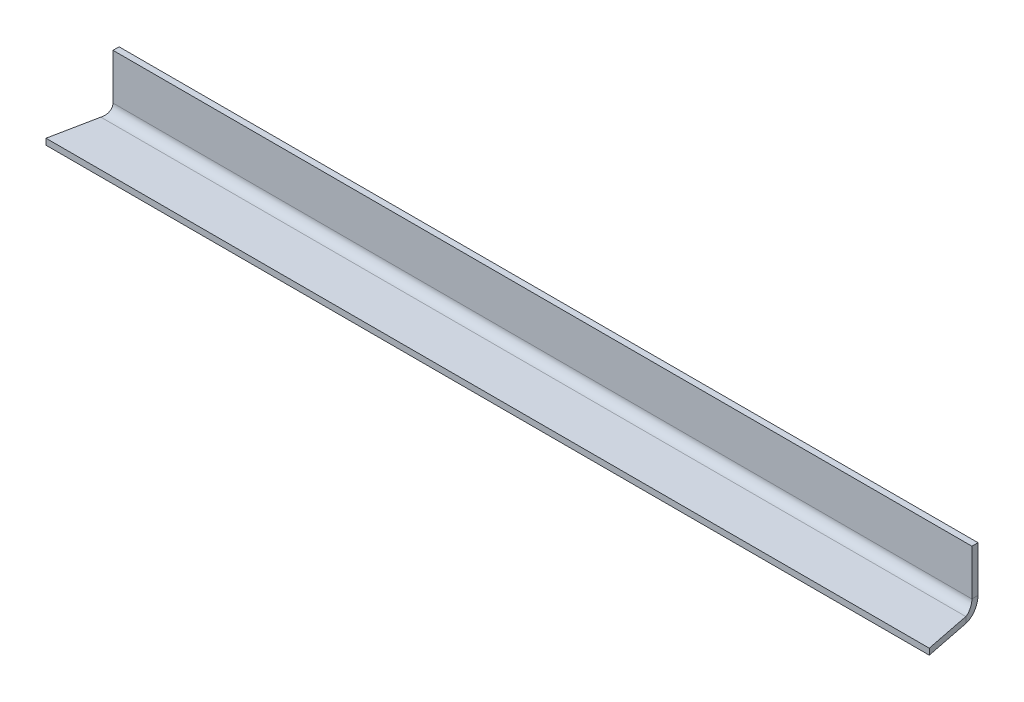
ISO-10303-21;
HEADER;
FILE_DESCRIPTION(('STEP AP214'),'2;1');
FILE_NAME('part.step','',(''),(''),'','','');
FILE_SCHEMA(('AUTOMOTIVE_DESIGN { 1 0 10303 214 1 1 1 1 }'));
ENDSEC;
DATA;
#1=APPLICATION_CONTEXT('core data for automotive mechanical design processes');
#2=APPLICATION_PROTOCOL_DEFINITION('international standard','automotive_design',2000,#1);
#3=PRODUCT_CONTEXT('',#1,'mechanical');
#4=PRODUCT('Part','Part','',(#3));
#5=PRODUCT_RELATED_PRODUCT_CATEGORY('part','',(#4));
#6=PRODUCT_DEFINITION_FORMATION('','',#4);
#7=PRODUCT_DEFINITION_CONTEXT('part definition',#1,'design');
#8=PRODUCT_DEFINITION('design','',#6,#7);
#9=PRODUCT_DEFINITION_SHAPE('','',#8);
#10=(LENGTH_UNIT() NAMED_UNIT(*) SI_UNIT(.MILLI.,.METRE.));
#11=(NAMED_UNIT(*) PLANE_ANGLE_UNIT() SI_UNIT($,.RADIAN.));
#12=(NAMED_UNIT(*) SI_UNIT($,.STERADIAN.) SOLID_ANGLE_UNIT());
#13=UNCERTAINTY_MEASURE_WITH_UNIT(LENGTH_MEASURE(1.E-05),#10,'distance_accuracy_value','');
#14=(GEOMETRIC_REPRESENTATION_CONTEXT(3) GLOBAL_UNCERTAINTY_ASSIGNED_CONTEXT((#13)) GLOBAL_UNIT_ASSIGNED_CONTEXT((#10,
#11,#12)) REPRESENTATION_CONTEXT('',''));
#15=CARTESIAN_POINT('',(0.,0.,0.));
#16=DIRECTION('',(0.,0.,1.));
#17=DIRECTION('',(1.,0.,0.));
#18=AXIS2_PLACEMENT_3D('',#15,#16,#17);
#19=CARTESIAN_POINT('',(0.,-4.,0.));
#20=DIRECTION('',(0.,1.,0.));
#21=DIRECTION('',(0.,0.,1.));
#22=AXIS2_PLACEMENT_3D('',#19,#20,#21);
#23=PLANE('',#22);
#24=DIRECTION('',(-0.19611613513818,0.,-0.980580675690921));
#25=VECTOR('',#24,1.);
#26=CARTESIAN_POINT('',(247.561941395943,-4.,-38.2503208145695));
#27=LINE('',#26,#25);
#28=CARTESIAN_POINT('',(255.561941395943,-4.,1.74967918543043));
#29=VERTEX_POINT('',#28);
#30=CARTESIAN_POINT('',(249.561941395943,-4.00000000000001,-28.2503208145695));
#31=VERTEX_POINT('',#30);
#32=EDGE_CURVE('E140',#29,#31,#27,.T.);
#33=ORIENTED_EDGE('',*,*,#32,.F.);
#34=DIRECTION('',(1.,0.,0.));
#35=VECTOR('',#34,1.);
#36=CARTESIAN_POINT('',(255.561941395943,-4.,1.74967918543043));
#37=LINE('',#36,#35);
#38=CARTESIAN_POINT('',(-324.438058604057,-4.,1.7496791854305));
#39=VERTEX_POINT('',#38);
#40=EDGE_CURVE('E164',#39,#29,#37,.T.);
#41=ORIENTED_EDGE('',*,*,#40,.F.);
#42=DIRECTION('',(0.196116135138188,0.,-0.98058067569092));
#43=VECTOR('',#42,1.);
#44=CARTESIAN_POINT('',(-311.623194968241,-4.,-62.3246389936495));
#45=LINE('',#44,#43);
#46=CARTESIAN_POINT('',(-318.438058604057,-4.,-28.2503208145695));
#47=VERTEX_POINT('',#46);
#48=EDGE_CURVE('E176',#39,#47,#45,.T.);
#49=ORIENTED_EDGE('',*,*,#48,.T.);
#50=DIRECTION('',(-1.,0.,0.));
#51=VECTOR('',#50,1.);
#52=CARTESIAN_POINT('',(-324.438058604057,-4.00000000000006,-28.2503208145695));
#53=LINE('',#52,#51);
#54=EDGE_CURVE('E156',#47,#31,#53,.F.);
#55=ORIENTED_EDGE('',*,*,#54,.T.);
#56=EDGE_LOOP('',(#33,#41,#49,#55));
#57=FACE_BOUND('',#56,.T.);
#58=ADVANCED_FACE('F58',(#57),#23,.F.);
#59=CARTESIAN_POINT('',(0.,0.,0.));
#60=DIRECTION('',(0.,1.,0.));
#61=DIRECTION('',(0.,0.,1.));
#62=AXIS2_PLACEMENT_3D('',#59,#60,#61);
#63=PLANE('',#62);
#64=DIRECTION('',(1.,0.,0.));
#65=VECTOR('',#64,1.);
#66=CARTESIAN_POINT('',(255.561941395943,0.,1.74967918543043));
#67=LINE('',#66,#65);
#68=CARTESIAN_POINT('',(-324.438058604057,0.,1.7496791854305));
#69=VERTEX_POINT('',#68);
#70=CARTESIAN_POINT('',(255.561941395943,0.,1.74967918543043));
#71=VERTEX_POINT('',#70);
#72=EDGE_CURVE('E150',#69,#71,#67,.T.);
#73=ORIENTED_EDGE('',*,*,#72,.T.);
#74=DIRECTION('',(-0.19611613513818,0.,-0.980580675690921));
#75=VECTOR('',#74,1.);
#76=CARTESIAN_POINT('',(247.561941395943,0.,-38.2503208145695));
#77=LINE('',#76,#75);
#78=CARTESIAN_POINT('',(249.561941395943,0.,-28.2503208145695));
#79=VERTEX_POINT('',#78);
#80=EDGE_CURVE('E81',#71,#79,#77,.T.);
#81=ORIENTED_EDGE('',*,*,#80,.T.);
#82=DIRECTION('',(-1.,0.,0.));
#83=VECTOR('',#82,1.);
#84=CARTESIAN_POINT('',(-324.438058604057,0.,-28.2503208145695));
#85=LINE('',#84,#83);
#86=CARTESIAN_POINT('',(-318.438058604057,0.,-28.2503208145695));
#87=VERTEX_POINT('',#86);
#88=EDGE_CURVE('E148',#87,#79,#85,.F.);
#89=ORIENTED_EDGE('',*,*,#88,.F.);
#90=DIRECTION('',(0.196116135138188,0.,-0.98058067569092));
#91=VECTOR('',#90,1.);
#92=CARTESIAN_POINT('',(-311.623194968241,0.,-62.3246389936495));
#93=LINE('',#92,#91);
#94=EDGE_CURVE('E174',#69,#87,#93,.T.);
#95=ORIENTED_EDGE('',*,*,#94,.F.);
#96=EDGE_LOOP('',(#73,#81,#89,#95));
#97=FACE_BOUND('',#96,.T.);
#98=ADVANCED_FACE('F146',(#97),#63,.T.);
#99=CARTESIAN_POINT('',(-324.438058604057,5.99999999999994,-28.2503208145695));
#100=DIRECTION('',(-1.,0.,0.));
#101=DIRECTION('',(0.,0.,-1.));
#102=AXIS2_PLACEMENT_3D('',#99,#100,#101);
#103=CYLINDRICAL_SURFACE('',#102,10.);
#104=DIRECTION('',(-1.,0.,0.));
#105=VECTOR('',#104,1.);
#106=CARTESIAN_POINT('',(0.,6.00000000000001,-38.2503208145695));
#107=LINE('',#106,#105);
#108=CARTESIAN_POINT('',(247.561941395943,6.00000000000001,-38.2503208145695));
#109=VERTEX_POINT('',#108);
#110=CARTESIAN_POINT('',(-316.438058604057,6.00000000000001,-38.2503208145695));
#111=VERTEX_POINT('',#110);
#112=EDGE_CURVE('E203',#109,#111,#107,.T.);
#113=ORIENTED_EDGE('',*,*,#112,.F.);
#114=CARTESIAN_POINT('',(249.561941395943,5.99999999999994,-28.2503208145695));
#115=DIRECTION('',(-0.980580675690921,0.,0.19611613513818));
#116=DIRECTION('',(-0.19611613513818,0.,-0.980580675690921));
#117=AXIS2_PLACEMENT_3D('',#114,#115,#116);
#118=ELLIPSE('',#117,10.1980390271856,10.);
#119=EDGE_CURVE('E136',#31,#109,#118,.F.);
#120=ORIENTED_EDGE('',*,*,#119,.F.);
#121=ORIENTED_EDGE('',*,*,#54,.F.);
#122=CARTESIAN_POINT('',(-318.438058604057,5.99999999999994,-28.2503208145695));
#123=DIRECTION('',(0.980580675690919,0.,0.196116135138188));
#124=DIRECTION('',(-0.196116135138188,0.,0.98058067569092));
#125=AXIS2_PLACEMENT_3D('',#122,#123,#124);
#126=ELLIPSE('',#125,10.1980390271856,10.);
#127=EDGE_CURVE('E141',#111,#47,#126,.F.);
#128=ORIENTED_EDGE('',*,*,#127,.F.);
#129=EDGE_LOOP('',(#113,#120,#121,#128));
#130=FACE_BOUND('',#129,.T.);
#131=ADVANCED_FACE('F231',(#130),#103,.T.);
#132=CARTESIAN_POINT('',(-324.438058604057,5.99999999999994,-28.2503208145695));
#133=DIRECTION('',(-1.,0.,0.));
#134=DIRECTION('',(0.,0.,-1.));
#135=AXIS2_PLACEMENT_3D('',#132,#133,#134);
#136=CYLINDRICAL_SURFACE('',#135,6.);
#137=CARTESIAN_POINT('',(249.561941395943,5.99999999999994,-28.2503208145695));
#138=DIRECTION('',(-0.948683298050516,0.,0.316227766016832));
#139=DIRECTION('',(-0.316227766016832,0.,-0.948683298050516));
#140=AXIS2_PLACEMENT_3D('',#137,#138,#139);
#141=ELLIPSE('',#140,6.32455532033674,6.);
#142=CARTESIAN_POINT('',(247.561941395943,6.00000000000001,-34.2503208145695));
#143=VERTEX_POINT('',#142);
#144=EDGE_CURVE('E126',#79,#143,#141,.F.);
#145=ORIENTED_EDGE('',*,*,#144,.T.);
#146=DIRECTION('',(1.,0.,0.));
#147=VECTOR('',#146,1.);
#148=CARTESIAN_POINT('',(255.561941395943,5.99999999999998,-34.2503208145695));
#149=LINE('',#148,#147);
#150=CARTESIAN_POINT('',(-316.438058604057,5.99999999999998,-34.2503208145695));
#151=VERTEX_POINT('',#150);
#152=EDGE_CURVE('E199',#143,#151,#149,.F.);
#153=ORIENTED_EDGE('',*,*,#152,.T.);
#154=CARTESIAN_POINT('',(-318.438058604057,5.99999999999994,-28.2503208145695));
#155=DIRECTION('',(0.948683298050511,0.,0.316227766016846));
#156=DIRECTION('',(-0.316227766016846,0.,0.948683298050511));
#157=AXIS2_PLACEMENT_3D('',#154,#155,#156);
#158=ELLIPSE('',#157,6.32455532033678,6.);
#159=EDGE_CURVE('E155',#151,#87,#158,.F.);
#160=ORIENTED_EDGE('',*,*,#159,.T.);
#161=ORIENTED_EDGE('',*,*,#88,.T.);
#162=EDGE_LOOP('',(#145,#153,#160,#161));
#163=FACE_BOUND('',#162,.T.);
#164=ADVANCED_FACE('F153',(#163),#136,.F.);
#165=CARTESIAN_POINT('',(0.,0.,-38.2503208145695));
#166=DIRECTION('',(0.,0.,-1.));
#167=DIRECTION('',(-1.,0.,0.));
#168=AXIS2_PLACEMENT_3D('',#165,#166,#167);
#169=PLANE('',#168);
#170=DIRECTION('',(-1.,0.,0.));
#171=VECTOR('',#170,1.);
#172=CARTESIAN_POINT('',(-324.438058604057,36.,-38.2503208145695));
#173=LINE('',#172,#171);
#174=CARTESIAN_POINT('',(247.561941395943,36.,-38.2503208145695));
#175=VERTEX_POINT('',#174);
#176=CARTESIAN_POINT('',(-316.438058604057,36.,-38.2503208145695));
#177=VERTEX_POINT('',#176);
#178=EDGE_CURVE('E157',#175,#177,#173,.T.);
#179=ORIENTED_EDGE('',*,*,#178,.F.);
#180=DIRECTION('',(0.,-1.,0.));
#181=VECTOR('',#180,1.);
#182=CARTESIAN_POINT('',(247.561941395943,36.,-38.2503208145695));
#183=LINE('',#182,#181);
#184=EDGE_CURVE('E135',#175,#109,#183,.T.);
#185=ORIENTED_EDGE('',*,*,#184,.T.);
#186=ORIENTED_EDGE('',*,*,#112,.T.);
#187=DIRECTION('',(0.,-1.,0.));
#188=VECTOR('',#187,1.);
#189=CARTESIAN_POINT('',(-316.438058604057,36.,-38.2503208145695));
#190=LINE('',#189,#188);
#191=EDGE_CURVE('E190',#177,#111,#190,.T.);
#192=ORIENTED_EDGE('',*,*,#191,.F.);
#193=EDGE_LOOP('',(#179,#185,#186,#192));
#194=FACE_BOUND('',#193,.T.);
#195=ADVANCED_FACE('F216',(#194),#169,.T.);
#196=CARTESIAN_POINT('',(0.,0.,-34.2503208145695));
#197=DIRECTION('',(0.,0.,-1.));
#198=DIRECTION('',(-1.,0.,0.));
#199=AXIS2_PLACEMENT_3D('',#196,#197,#198);
#200=PLANE('',#199);
#201=DIRECTION('',(0.,1.,0.));
#202=VECTOR('',#201,1.);
#203=CARTESIAN_POINT('',(247.561941395943,0.,-34.2503208145695));
#204=LINE('',#203,#202);
#205=CARTESIAN_POINT('',(247.561941395943,36.,-34.2503208145695));
#206=VERTEX_POINT('',#205);
#207=EDGE_CURVE('E213',#206,#143,#204,.F.);
#208=ORIENTED_EDGE('',*,*,#207,.F.);
#209=DIRECTION('',(1.,0.,0.));
#210=VECTOR('',#209,1.);
#211=CARTESIAN_POINT('',(0.,36.,-34.2503208145695));
#212=LINE('',#211,#210);
#213=CARTESIAN_POINT('',(-316.438058604057,36.,-34.2503208145695));
#214=VERTEX_POINT('',#213);
#215=EDGE_CURVE('E73',#206,#214,#212,.F.);
#216=ORIENTED_EDGE('',*,*,#215,.T.);
#217=DIRECTION('',(0.,1.,0.));
#218=VECTOR('',#217,1.);
#219=CARTESIAN_POINT('',(-316.438058604057,0.,-34.2503208145695));
#220=LINE('',#219,#218);
#221=EDGE_CURVE('E191',#214,#151,#220,.F.);
#222=ORIENTED_EDGE('',*,*,#221,.T.);
#223=ORIENTED_EDGE('',*,*,#152,.F.);
#224=EDGE_LOOP('',(#208,#216,#222,#223));
#225=FACE_BOUND('',#224,.T.);
#226=ADVANCED_FACE('F212',(#225),#200,.F.);
#227=CARTESIAN_POINT('',(-324.438058604057,36.,-38.2503208145695));
#228=DIRECTION('',(0.,1.,0.));
#229=DIRECTION('',(0.,0.,1.));
#230=AXIS2_PLACEMENT_3D('',#227,#228,#229);
#231=PLANE('',#230);
#232=ORIENTED_EDGE('',*,*,#215,.F.);
#233=DIRECTION('',(0.,0.,-1.));
#234=VECTOR('',#233,1.);
#235=CARTESIAN_POINT('',(247.561941395943,36.,-38.2503208145695));
#236=LINE('',#235,#234);
#237=EDGE_CURVE('E180',#175,#206,#236,.F.);
#238=ORIENTED_EDGE('',*,*,#237,.F.);
#239=ORIENTED_EDGE('',*,*,#178,.T.);
#240=DIRECTION('',(0.,0.,-1.));
#241=VECTOR('',#240,1.);
#242=CARTESIAN_POINT('',(-316.438058604057,36.,-38.2503208145695));
#243=LINE('',#242,#241);
#244=EDGE_CURVE('E193',#177,#214,#243,.F.);
#245=ORIENTED_EDGE('',*,*,#244,.T.);
#246=EDGE_LOOP('',(#232,#238,#239,#245));
#247=FACE_BOUND('',#246,.T.);
#248=ADVANCED_FACE('F215',(#247),#231,.T.);
#249=CARTESIAN_POINT('',(255.561941395943,-4.,1.74967918543043));
#250=DIRECTION('',(0.,0.,1.));
#251=DIRECTION('',(1.,0.,0.));
#252=AXIS2_PLACEMENT_3D('',#249,#250,#251);
#253=PLANE('',#252);
#254=ORIENTED_EDGE('',*,*,#72,.F.);
#255=DIRECTION('',(0.,1.,0.));
#256=VECTOR('',#255,1.);
#257=CARTESIAN_POINT('',(-324.438058604057,-4.,1.7496791854305));
#258=LINE('',#257,#256);
#259=EDGE_CURVE('E62',#39,#69,#258,.T.);
#260=ORIENTED_EDGE('',*,*,#259,.F.);
#261=ORIENTED_EDGE('',*,*,#40,.T.);
#262=DIRECTION('',(0.,1.,0.));
#263=VECTOR('',#262,1.);
#264=CARTESIAN_POINT('',(255.561941395943,-4.,1.74967918543043));
#265=LINE('',#264,#263);
#266=EDGE_CURVE('E13',#29,#71,#265,.T.);
#267=ORIENTED_EDGE('',*,*,#266,.T.);
#268=EDGE_LOOP('',(#254,#260,#261,#267));
#269=FACE_BOUND('',#268,.T.);
#270=ADVANCED_FACE('F60',(#269),#253,.T.);
#271=CARTESIAN_POINT('',(-316.438058604057,36.,-38.2503208145695));
#272=DIRECTION('',(1.,0.,0.));
#273=DIRECTION('',(0.,-1.,0.));
#274=AXIS2_PLACEMENT_3D('',#271,#272,#273);
#275=PLANE('',#274);
#276=ORIENTED_EDGE('',*,*,#191,.T.);
#277=DIRECTION('',(0.,0.,-1.));
#278=VECTOR('',#277,1.);
#279=CARTESIAN_POINT('',(-316.438058604057,6.00000000000001,-38.2503208145695));
#280=LINE('',#279,#278);
#281=EDGE_CURVE('E196',#111,#151,#280,.F.);
#282=ORIENTED_EDGE('',*,*,#281,.T.);
#283=ORIENTED_EDGE('',*,*,#221,.F.);
#284=ORIENTED_EDGE('',*,*,#244,.F.);
#285=EDGE_LOOP('',(#276,#282,#283,#284));
#286=FACE_BOUND('',#285,.T.);
#287=ADVANCED_FACE('F209',(#286),#275,.F.);
#288=CARTESIAN_POINT('',(-311.623194968241,0.,-62.3246389936495));
#289=DIRECTION('',(0.980580675690919,0.,0.196116135138188));
#290=DIRECTION('',(0.196116135138188,0.,-0.98058067569092));
#291=AXIS2_PLACEMENT_3D('',#288,#289,#290);
#292=PLANE('',#291);
#293=ORIENTED_EDGE('',*,*,#94,.T.);
#294=DIRECTION('',(0.,1.,0.));
#295=VECTOR('',#294,1.);
#296=CARTESIAN_POINT('',(-318.438058604057,0.,-28.2503208145695));
#297=LINE('',#296,#295);
#298=EDGE_CURVE('E187',#87,#47,#297,.F.);
#299=ORIENTED_EDGE('',*,*,#298,.T.);
#300=ORIENTED_EDGE('',*,*,#48,.F.);
#301=ORIENTED_EDGE('',*,*,#259,.T.);
#302=EDGE_LOOP('',(#293,#299,#300,#301));
#303=FACE_BOUND('',#302,.T.);
#304=ADVANCED_FACE('F172',(#303),#292,.F.);
#305=CARTESIAN_POINT('',(-320.438058604057,5.99999999999994,-18.2503208145695));
#306=CARTESIAN_POINT('',(-320.438058604057,5.99999999999994,-19.5836541479029));
#307=CARTESIAN_POINT('',(-320.438058604057,5.99999999999994,-20.9169874812362));
#308=CARTESIAN_POINT('',(-320.438058604057,5.99999999999994,-22.2503208145695));
#309=CARTESIAN_POINT('',(-320.438058604057,25.9999999999999,-18.2503208145695));
#310=CARTESIAN_POINT('',(-320.438058604057,23.3333333333333,-19.5836541479029));
#311=CARTESIAN_POINT('',(-320.438058604057,20.6666666666666,-20.9169874812362));
#312=CARTESIAN_POINT('',(-320.438058604057,17.9999999999999,-22.2503208145695));
#313=CARTESIAN_POINT('',(-316.438058604057,25.9999999999999,-38.2503208145695));
#314=CARTESIAN_POINT('',(-316.438058604057,23.3333333333333,-36.9169874812362));
#315=CARTESIAN_POINT('',(-316.438058604057,20.6666666666666,-35.5836541479029));
#316=CARTESIAN_POINT('',(-316.438058604057,17.9999999999999,-34.2503208145695));
#317=CARTESIAN_POINT('',(-316.438058604057,5.99999999999994,-38.2503208145695));
#318=CARTESIAN_POINT('',(-316.438058604057,5.99999999999994,-36.9169874812362));
#319=CARTESIAN_POINT('',(-316.438058604057,5.99999999999994,-35.5836541479029));
#320=CARTESIAN_POINT('',(-316.438058604057,5.99999999999994,-34.2503208145695));
#321=CARTESIAN_POINT('',(-316.438058604057,-14.0000000000001,-38.2503208145695));
#322=CARTESIAN_POINT('',(-316.438058604057,-11.3333333333334,-36.9169874812362));
#323=CARTESIAN_POINT('',(-316.438058604057,-8.66666666666672,-35.5836541479029));
#324=CARTESIAN_POINT('',(-316.438058604057,-6.00000000000005,-34.2503208145695));
#325=CARTESIAN_POINT('',(-320.438058604057,-14.0000000000001,-18.2503208145695));
#326=CARTESIAN_POINT('',(-320.438058604057,-11.3333333333334,-19.5836541479029));
#327=CARTESIAN_POINT('',(-320.438058604057,-8.66666666666672,-20.9169874812362));
#328=CARTESIAN_POINT('',(-320.438058604057,-6.00000000000005,-22.2503208145695));
#329=CARTESIAN_POINT('',(-320.438058604057,5.99999999999994,-18.2503208145695));
#330=CARTESIAN_POINT('',(-320.438058604057,5.99999999999994,-19.5836541479029));
#331=CARTESIAN_POINT('',(-320.438058604057,5.99999999999994,-20.9169874812362));
#332=CARTESIAN_POINT('',(-320.438058604057,5.99999999999994,-22.2503208145695));
#333=(BOUNDED_SURFACE() B_SPLINE_SURFACE(3,3,((#305,#306,#307,#308),(#309,#310,#311,#312),(#313,
#314,#315,#316),(#317,#318,#319,#320),(#321,#322,#323,#324),(#325,#326,#327,#328),(#329,#330,
#331,#332)),.UNSPECIFIED.,.T.,.F.,.F.) B_SPLINE_SURFACE_WITH_KNOTS((4,3,4),(4,4),(0.,0.5,1.),
(0.,1.),.UNSPECIFIED.) GEOMETRIC_REPRESENTATION_ITEM() RATIONAL_B_SPLINE_SURFACE(((1.,1.,1.,1.),
(0.333333333333333,0.333333333333333,0.333333333333333,0.333333333333333),(0.333333333333333,
0.333333333333333,0.333333333333333,0.333333333333333),(1.,1.,1.,1.),(0.333333333333333,
0.333333333333333,0.333333333333333,0.333333333333333),(0.333333333333333,0.333333333333333,
0.333333333333333,0.333333333333333),(1.,1.,1.,1.))) REPRESENTATION_ITEM('') SURFACE());
#334=ORIENTED_EDGE('',*,*,#127,.T.);
#335=ORIENTED_EDGE('',*,*,#298,.F.);
#336=ORIENTED_EDGE('',*,*,#159,.F.);
#337=ORIENTED_EDGE('',*,*,#281,.F.);
#338=EDGE_LOOP('',(#334,#335,#336,#337));
#339=FACE_BOUND('',#338,.T.);
#340=ADVANCED_FACE('F206',(#339),#333,.T.);
#341=CARTESIAN_POINT('',(247.561941395943,-4.,-38.2503208145695));
#342=DIRECTION('',(0.980580675690921,0.,-0.19611613513818));
#343=DIRECTION('',(-0.19611613513818,0.,-0.980580675690921));
#344=AXIS2_PLACEMENT_3D('',#341,#342,#343);
#345=PLANE('',#344);
#346=ORIENTED_EDGE('',*,*,#266,.F.);
#347=ORIENTED_EDGE('',*,*,#32,.T.);
#348=DIRECTION('',(0.,-1.,0.));
#349=VECTOR('',#348,1.);
#350=CARTESIAN_POINT('',(249.561941395943,-4.00000000000001,-28.2503208145695));
#351=LINE('',#350,#349);
#352=EDGE_CURVE('E128',#31,#79,#351,.F.);
#353=ORIENTED_EDGE('',*,*,#352,.T.);
#354=ORIENTED_EDGE('',*,*,#80,.F.);
#355=EDGE_LOOP('',(#346,#347,#353,#354));
#356=FACE_BOUND('',#355,.T.);
#357=ADVANCED_FACE('F138',(#356),#345,.T.);
#358=CARTESIAN_POINT('',(247.561941395943,36.,-38.2503208145695));
#359=DIRECTION('',(1.,0.,0.));
#360=DIRECTION('',(0.,-1.,0.));
#361=AXIS2_PLACEMENT_3D('',#358,#359,#360);
#362=PLANE('',#361);
#363=ORIENTED_EDGE('',*,*,#184,.F.);
#364=ORIENTED_EDGE('',*,*,#237,.T.);
#365=ORIENTED_EDGE('',*,*,#207,.T.);
#366=DIRECTION('',(0.,0.,-1.));
#367=VECTOR('',#366,1.);
#368=CARTESIAN_POINT('',(247.561941395943,6.00000000000001,-38.2503208145695));
#369=LINE('',#368,#367);
#370=EDGE_CURVE('E131',#109,#143,#369,.F.);
#371=ORIENTED_EDGE('',*,*,#370,.F.);
#372=EDGE_LOOP('',(#363,#364,#365,#371));
#373=FACE_BOUND('',#372,.T.);
#374=ADVANCED_FACE('F247',(#373),#362,.T.);
#375=CARTESIAN_POINT('',(247.561941395943,5.99999999999994,-38.2503208145695));
#376=CARTESIAN_POINT('',(247.561941395943,5.99999999999994,-36.9169874812362));
#377=CARTESIAN_POINT('',(247.561941395943,5.99999999999994,-35.5836541479029));
#378=CARTESIAN_POINT('',(247.561941395943,5.99999999999994,-34.2503208145695));
#379=CARTESIAN_POINT('',(247.561941395943,25.9999999999999,-38.2503208145695));
#380=CARTESIAN_POINT('',(247.561941395943,23.3333333333333,-36.9169874812362));
#381=CARTESIAN_POINT('',(247.561941395943,20.6666666666666,-35.5836541479029));
#382=CARTESIAN_POINT('',(247.561941395943,17.9999999999999,-34.2503208145695));
#383=CARTESIAN_POINT('',(251.561941395943,25.9999999999999,-18.2503208145695));
#384=CARTESIAN_POINT('',(251.561941395943,23.3333333333333,-19.5836541479029));
#385=CARTESIAN_POINT('',(251.561941395943,20.6666666666666,-20.9169874812362));
#386=CARTESIAN_POINT('',(251.561941395943,17.9999999999999,-22.2503208145695));
#387=CARTESIAN_POINT('',(251.561941395943,5.99999999999994,-18.2503208145695));
#388=CARTESIAN_POINT('',(251.561941395943,5.99999999999994,-19.5836541479029));
#389=CARTESIAN_POINT('',(251.561941395943,5.99999999999994,-20.9169874812362));
#390=CARTESIAN_POINT('',(251.561941395943,5.99999999999994,-22.2503208145695));
#391=CARTESIAN_POINT('',(251.561941395943,-14.0000000000001,-18.2503208145695));
#392=CARTESIAN_POINT('',(251.561941395943,-11.3333333333334,-19.5836541479029));
#393=CARTESIAN_POINT('',(251.561941395943,-8.66666666666672,-20.9169874812362));
#394=CARTESIAN_POINT('',(251.561941395943,-6.00000000000006,-22.2503208145695));
#395=CARTESIAN_POINT('',(247.561941395943,-14.0000000000001,-38.2503208145695));
#396=CARTESIAN_POINT('',(247.561941395943,-11.3333333333334,-36.9169874812362));
#397=CARTESIAN_POINT('',(247.561941395943,-8.66666666666672,-35.5836541479029));
#398=CARTESIAN_POINT('',(247.561941395943,-6.00000000000006,-34.2503208145695));
#399=CARTESIAN_POINT('',(247.561941395943,5.99999999999994,-38.2503208145695));
#400=CARTESIAN_POINT('',(247.561941395943,5.99999999999994,-36.9169874812362));
#401=CARTESIAN_POINT('',(247.561941395943,5.99999999999994,-35.5836541479029));
#402=CARTESIAN_POINT('',(247.561941395943,5.99999999999994,-34.2503208145695));
#403=(BOUNDED_SURFACE() B_SPLINE_SURFACE(3,3,((#375,#376,#377,#378),(#379,#380,#381,#382),(#383,
#384,#385,#386),(#387,#388,#389,#390),(#391,#392,#393,#394),(#395,#396,#397,#398),(#399,#400,
#401,#402)),.UNSPECIFIED.,.T.,.F.,.F.) B_SPLINE_SURFACE_WITH_KNOTS((4,3,4),(4,4),(0.,0.5,1.),
(0.,1.),.UNSPECIFIED.) GEOMETRIC_REPRESENTATION_ITEM() RATIONAL_B_SPLINE_SURFACE(((1.,1.,1.,1.),
(0.333333333333333,0.333333333333333,0.333333333333333,0.333333333333333),(0.333333333333333,
0.333333333333333,0.333333333333333,0.333333333333333),(1.,1.,1.,1.),(0.333333333333333,
0.333333333333333,0.333333333333333,0.333333333333333),(0.333333333333333,0.333333333333333,
0.333333333333333,0.333333333333333),(1.,1.,1.,1.))) REPRESENTATION_ITEM('') SURFACE());
#404=ORIENTED_EDGE('',*,*,#119,.T.);
#405=ORIENTED_EDGE('',*,*,#370,.T.);
#406=ORIENTED_EDGE('',*,*,#144,.F.);
#407=ORIENTED_EDGE('',*,*,#352,.F.);
#408=EDGE_LOOP('',(#404,#405,#406,#407));
#409=FACE_BOUND('',#408,.T.);
#410=ADVANCED_FACE('F127',(#409),#403,.T.);
#411=CLOSED_SHELL('',(#58,#98,#131,#164,#195,#226,#248,#270,#287,#304,#340,#357,#374,#410));
#412=MANIFOLD_SOLID_BREP('B2',#411);
#413=ADVANCED_BREP_SHAPE_REPRESENTATION('',(#18,#412),#14);
#414=SHAPE_DEFINITION_REPRESENTATION(#9,#413);
ENDSEC;
END-ISO-10303-21;
